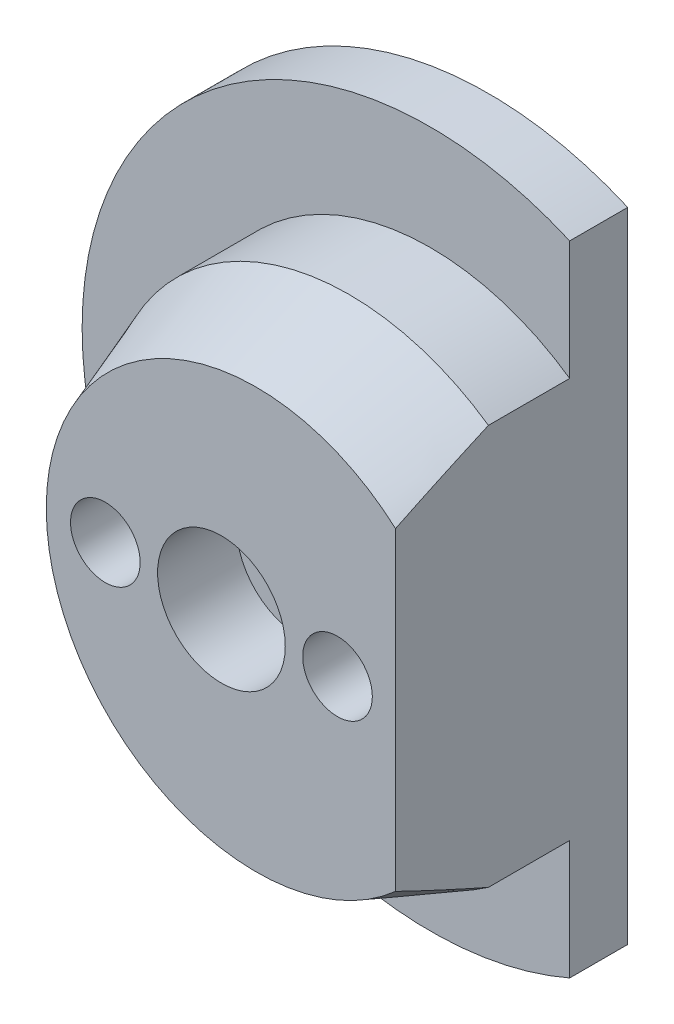
ISO-10303-21;
HEADER;
FILE_DESCRIPTION(('STEP AP214'),'2;1');
FILE_NAME('part.step','',(''),(''),'','','');
FILE_SCHEMA(('AUTOMOTIVE_DESIGN { 1 0 10303 214 1 1 1 1 }'));
ENDSEC;
DATA;
#1=APPLICATION_CONTEXT('core data for automotive mechanical design processes');
#2=APPLICATION_PROTOCOL_DEFINITION('international standard','automotive_design',2000,#1);
#3=PRODUCT_CONTEXT('',#1,'mechanical');
#4=PRODUCT('Part','Part','',(#3));
#5=PRODUCT_RELATED_PRODUCT_CATEGORY('part','',(#4));
#6=PRODUCT_DEFINITION_FORMATION('','',#4);
#7=PRODUCT_DEFINITION_CONTEXT('part definition',#1,'design');
#8=PRODUCT_DEFINITION('design','',#6,#7);
#9=PRODUCT_DEFINITION_SHAPE('','',#8);
#10=(LENGTH_UNIT() NAMED_UNIT(*) SI_UNIT(.MILLI.,.METRE.));
#11=(NAMED_UNIT(*) PLANE_ANGLE_UNIT() SI_UNIT($,.RADIAN.));
#12=(NAMED_UNIT(*) SI_UNIT($,.STERADIAN.) SOLID_ANGLE_UNIT());
#13=UNCERTAINTY_MEASURE_WITH_UNIT(LENGTH_MEASURE(1.E-05),#10,'distance_accuracy_value','');
#14=(GEOMETRIC_REPRESENTATION_CONTEXT(3) GLOBAL_UNCERTAINTY_ASSIGNED_CONTEXT((#13)) GLOBAL_UNIT_ASSIGNED_CONTEXT((#10,
#11,#12)) REPRESENTATION_CONTEXT('',''));
#15=CARTESIAN_POINT('',(0.,0.,0.));
#16=DIRECTION('',(0.,0.,1.));
#17=DIRECTION('',(1.,0.,0.));
#18=AXIS2_PLACEMENT_3D('',#15,#16,#17);
#19=CARTESIAN_POINT('',(0.,0.,20.));
#20=DIRECTION('',(0.,0.,-1.));
#21=DIRECTION('',(-1.,0.,0.));
#22=AXIS2_PLACEMENT_3D('',#19,#20,#21);
#23=CYLINDRICAL_SURFACE('',#22,30.);
#24=CARTESIAN_POINT('',(0.,0.,5.));
#25=DIRECTION('',(0.,0.,1.));
#26=DIRECTION('',(1.,0.,0.));
#27=AXIS2_PLACEMENT_3D('',#24,#25,#26);
#28=CIRCLE('',#27,30.);
#29=CARTESIAN_POINT('',(12.,27.495454169735,5.));
#30=VERTEX_POINT('',#29);
#31=CARTESIAN_POINT('',(12.,-27.495454169735,5.));
#32=VERTEX_POINT('',#31);
#33=EDGE_CURVE('E104',#30,#32,#28,.T.);
#34=ORIENTED_EDGE('',*,*,#33,.F.);
#35=DIRECTION('',(0.,0.,-1.));
#36=VECTOR('',#35,1.);
#37=CARTESIAN_POINT('',(12.,27.495454169735,20.));
#38=LINE('',#37,#36);
#39=CARTESIAN_POINT('',(12.,27.495454169735,0.));
#40=VERTEX_POINT('',#39);
#41=EDGE_CURVE('E61',#30,#40,#38,.T.);
#42=ORIENTED_EDGE('',*,*,#41,.T.);
#43=CARTESIAN_POINT('',(0.,0.,0.));
#44=DIRECTION('',(0.,0.,1.));
#45=DIRECTION('',(1.,0.,0.));
#46=AXIS2_PLACEMENT_3D('',#43,#44,#45);
#47=CIRCLE('',#46,30.);
#48=CARTESIAN_POINT('',(12.,-27.495454169735,0.));
#49=VERTEX_POINT('',#48);
#50=EDGE_CURVE('E98',#40,#49,#47,.T.);
#51=ORIENTED_EDGE('',*,*,#50,.T.);
#52=DIRECTION('',(0.,0.,-1.));
#53=VECTOR('',#52,1.);
#54=CARTESIAN_POINT('',(12.,-27.495454169735,20.));
#55=LINE('',#54,#53);
#56=EDGE_CURVE('E136',#49,#32,#55,.F.);
#57=ORIENTED_EDGE('',*,*,#56,.T.);
#58=EDGE_LOOP('',(#34,#42,#51,#57));
#59=FACE_BOUND('',#58,.T.);
#60=ADVANCED_FACE('F35',(#59),#23,.T.);
#61=CARTESIAN_POINT('',(0.,0.,20.));
#62=DIRECTION('',(0.,0.,1.));
#63=DIRECTION('',(1.,0.,0.));
#64=AXIS2_PLACEMENT_3D('',#61,#62,#63);
#65=PLANE('',#64);
#66=DIRECTION('',(0.,-1.,0.));
#67=VECTOR('',#66,1.);
#68=CARTESIAN_POINT('',(12.,33.1105844431679,20.));
#69=LINE('',#68,#67);
#70=CARTESIAN_POINT('',(12.,13.5345616293322,20.));
#71=VERTEX_POINT('',#70);
#72=CARTESIAN_POINT('',(12.,-13.5345616293321,20.));
#73=VERTEX_POINT('',#72);
#74=EDGE_CURVE('E54',#71,#73,#69,.T.);
#75=ORIENTED_EDGE('',*,*,#74,.F.);
#76=CARTESIAN_POINT('',(0.,0.,20.));
#77=DIRECTION('',(0.,0.,1.));
#78=DIRECTION('',(1.,0.,0.));
#79=AXIS2_PLACEMENT_3D('',#76,#77,#78);
#80=CIRCLE('',#79,18.0882381258704);
#81=EDGE_CURVE('E94',#71,#73,#80,.T.);
#82=ORIENTED_EDGE('',*,*,#81,.T.);
#83=EDGE_LOOP('',(#75,#82));
#84=FACE_BOUND('',#83,.T.);
#85=CARTESIAN_POINT('',(7.,0.,20.));
#86=DIRECTION('',(0.,0.,1.));
#87=DIRECTION('',(1.,0.,0.));
#88=AXIS2_PLACEMENT_3D('',#85,#86,#87);
#89=CIRCLE('',#88,2.99999999999999);
#90=CARTESIAN_POINT('',(9.99999999999999,0.,20.));
#91=VERTEX_POINT('',#90);
#92=EDGE_CURVE('E111',#91,#91,#89,.T.);
#93=ORIENTED_EDGE('',*,*,#92,.F.);
#94=EDGE_LOOP('',(#93));
#95=FACE_BOUND('',#94,.T.);
#96=CARTESIAN_POINT('',(-13.,0.,20.));
#97=DIRECTION('',(0.,0.,1.));
#98=DIRECTION('',(1.,0.,0.));
#99=AXIS2_PLACEMENT_3D('',#96,#97,#98);
#100=CIRCLE('',#99,2.99999999999999);
#101=CARTESIAN_POINT('',(-10.,0.,20.));
#102=VERTEX_POINT('',#101);
#103=EDGE_CURVE('E117',#102,#102,#100,.T.);
#104=ORIENTED_EDGE('',*,*,#103,.F.);
#105=EDGE_LOOP('',(#104));
#106=FACE_BOUND('',#105,.T.);
#107=CARTESIAN_POINT('',(-3.,0.,20.));
#108=DIRECTION('',(0.,0.,1.));
#109=DIRECTION('',(1.,0.,0.));
#110=AXIS2_PLACEMENT_3D('',#107,#108,#109);
#111=CIRCLE('',#110,5.5);
#112=CARTESIAN_POINT('',(2.5,0.,20.));
#113=VERTEX_POINT('',#112);
#114=EDGE_CURVE('E106',#113,#113,#111,.T.);
#115=ORIENTED_EDGE('',*,*,#114,.F.);
#116=EDGE_LOOP('',(#115));
#117=FACE_BOUND('',#116,.T.);
#118=ADVANCED_FACE('F92',(#84,#95,#106,#117),#65,.T.);
#119=CARTESIAN_POINT('',(0.,0.,0.));
#120=DIRECTION('',(0.,0.,1.));
#121=DIRECTION('',(1.,0.,0.));
#122=AXIS2_PLACEMENT_3D('',#119,#120,#121);
#123=PLANE('',#122);
#124=CARTESIAN_POINT('',(-3.,0.,0.));
#125=DIRECTION('',(0.,0.,1.));
#126=DIRECTION('',(1.,0.,0.));
#127=AXIS2_PLACEMENT_3D('',#124,#125,#126);
#128=CIRCLE('',#127,3.3);
#129=CARTESIAN_POINT('',(0.299999999999996,0.,0.));
#130=VERTEX_POINT('',#129);
#131=EDGE_CURVE('E120',#130,#130,#128,.T.);
#132=ORIENTED_EDGE('',*,*,#131,.T.);
#133=EDGE_LOOP('',(#132));
#134=FACE_BOUND('',#133,.T.);
#135=CARTESIAN_POINT('',(-13.,0.,0.));
#136=DIRECTION('',(0.,0.,1.));
#137=DIRECTION('',(1.,0.,0.));
#138=AXIS2_PLACEMENT_3D('',#135,#136,#137);
#139=CIRCLE('',#138,2.99999999999999);
#140=CARTESIAN_POINT('',(-10.,0.,0.));
#141=VERTEX_POINT('',#140);
#142=EDGE_CURVE('E114',#141,#141,#139,.T.);
#143=ORIENTED_EDGE('',*,*,#142,.T.);
#144=EDGE_LOOP('',(#143));
#145=FACE_BOUND('',#144,.T.);
#146=CARTESIAN_POINT('',(7.,0.,0.));
#147=DIRECTION('',(0.,0.,1.));
#148=DIRECTION('',(1.,0.,0.));
#149=AXIS2_PLACEMENT_3D('',#146,#147,#148);
#150=CIRCLE('',#149,2.99999999999999);
#151=CARTESIAN_POINT('',(9.99999999999999,0.,0.));
#152=VERTEX_POINT('',#151);
#153=EDGE_CURVE('E101',#152,#152,#150,.T.);
#154=ORIENTED_EDGE('',*,*,#153,.T.);
#155=EDGE_LOOP('',(#154));
#156=FACE_BOUND('',#155,.T.);
#157=ORIENTED_EDGE('',*,*,#50,.F.);
#158=DIRECTION('',(0.,-1.,0.));
#159=VECTOR('',#158,1.);
#160=CARTESIAN_POINT('',(12.,33.1105844431679,0.));
#161=LINE('',#160,#159);
#162=EDGE_CURVE('E95',#40,#49,#161,.T.);
#163=ORIENTED_EDGE('',*,*,#162,.T.);
#164=EDGE_LOOP('',(#157,#163));
#165=FACE_BOUND('',#164,.T.);
#166=ADVANCED_FACE('F146',(#134,#145,#156,#165),#123,.F.);
#167=CARTESIAN_POINT('',(7.,0.,20.));
#168=DIRECTION('',(0.,0.,1.));
#169=DIRECTION('',(1.,0.,0.));
#170=AXIS2_PLACEMENT_3D('',#167,#168,#169);
#171=CYLINDRICAL_SURFACE('',#170,2.99999999999999);
#172=ORIENTED_EDGE('',*,*,#153,.F.);
#173=EDGE_LOOP('',(#172));
#174=FACE_BOUND('',#173,.T.);
#175=ORIENTED_EDGE('',*,*,#92,.T.);
#176=EDGE_LOOP('',(#175));
#177=FACE_BOUND('',#176,.T.);
#178=ADVANCED_FACE('F171',(#174,#177),#171,.F.);
#179=CARTESIAN_POINT('',(-13.,0.,20.));
#180=DIRECTION('',(0.,0.,1.));
#181=DIRECTION('',(1.,0.,0.));
#182=AXIS2_PLACEMENT_3D('',#179,#180,#181);
#183=CYLINDRICAL_SURFACE('',#182,2.99999999999999);
#184=ORIENTED_EDGE('',*,*,#142,.F.);
#185=EDGE_LOOP('',(#184));
#186=FACE_BOUND('',#185,.T.);
#187=ORIENTED_EDGE('',*,*,#103,.T.);
#188=EDGE_LOOP('',(#187));
#189=FACE_BOUND('',#188,.T.);
#190=ADVANCED_FACE('F176',(#186,#189),#183,.F.);
#191=CARTESIAN_POINT('',(-3.,0.,20.));
#192=DIRECTION('',(0.,0.,1.));
#193=DIRECTION('',(1.,0.,0.));
#194=AXIS2_PLACEMENT_3D('',#191,#192,#193);
#195=CYLINDRICAL_SURFACE('',#194,3.3);
#196=ORIENTED_EDGE('',*,*,#131,.F.);
#197=EDGE_LOOP('',(#196));
#198=FACE_BOUND('',#197,.T.);
#199=CARTESIAN_POINT('',(-3.,0.,13.2));
#200=DIRECTION('',(0.,0.,1.));
#201=DIRECTION('',(1.,0.,0.));
#202=AXIS2_PLACEMENT_3D('',#199,#200,#201);
#203=CIRCLE('',#202,3.3);
#204=CARTESIAN_POINT('',(0.299999999999998,0.,13.2));
#205=VERTEX_POINT('',#204);
#206=EDGE_CURVE('E123',#205,#205,#203,.T.);
#207=ORIENTED_EDGE('',*,*,#206,.T.);
#208=EDGE_LOOP('',(#207));
#209=FACE_BOUND('',#208,.T.);
#210=ADVANCED_FACE('F180',(#198,#209),#195,.F.);
#211=CARTESIAN_POINT('',(0.299999999999998,0.,13.2));
#212=DIRECTION('',(0.,0.,-1.));
#213=DIRECTION('',(-1.,0.,0.));
#214=AXIS2_PLACEMENT_3D('',#211,#212,#213);
#215=PLANE('',#214);
#216=ORIENTED_EDGE('',*,*,#206,.F.);
#217=EDGE_LOOP('',(#216));
#218=FACE_BOUND('',#217,.T.);
#219=CARTESIAN_POINT('',(-3.,0.,13.2));
#220=DIRECTION('',(0.,0.,1.));
#221=DIRECTION('',(1.,0.,0.));
#222=AXIS2_PLACEMENT_3D('',#219,#220,#221);
#223=CIRCLE('',#222,5.5);
#224=CARTESIAN_POINT('',(2.5,0.,13.2));
#225=VERTEX_POINT('',#224);
#226=EDGE_CURVE('E126',#225,#225,#223,.T.);
#227=ORIENTED_EDGE('',*,*,#226,.T.);
#228=EDGE_LOOP('',(#227));
#229=FACE_BOUND('',#228,.T.);
#230=ADVANCED_FACE('F184',(#218,#229),#215,.F.);
#231=CARTESIAN_POINT('',(-3.,0.,20.));
#232=DIRECTION('',(0.,0.,1.));
#233=DIRECTION('',(1.,0.,0.));
#234=AXIS2_PLACEMENT_3D('',#231,#232,#233);
#235=CYLINDRICAL_SURFACE('',#234,5.5);
#236=ORIENTED_EDGE('',*,*,#226,.F.);
#237=EDGE_LOOP('',(#236));
#238=FACE_BOUND('',#237,.T.);
#239=ORIENTED_EDGE('',*,*,#114,.T.);
#240=EDGE_LOOP('',(#239));
#241=FACE_BOUND('',#240,.T.);
#242=ADVANCED_FACE('F162',(#238,#241),#235,.F.);
#243=CARTESIAN_POINT('',(0.,0.,5.));
#244=DIRECTION('',(0.,0.,1.));
#245=DIRECTION('',(1.,0.,0.));
#246=AXIS2_PLACEMENT_3D('',#243,#244,#245);
#247=PLANE('',#246);
#248=DIRECTION('',(0.,-1.,0.));
#249=VECTOR('',#248,1.);
#250=CARTESIAN_POINT('',(12.,0.,5.));
#251=LINE('',#250,#249);
#252=CARTESIAN_POINT('',(12.,17.2336879396141,5.));
#253=VERTEX_POINT('',#252);
#254=EDGE_CURVE('E134',#30,#253,#251,.T.);
#255=ORIENTED_EDGE('',*,*,#254,.F.);
#256=ORIENTED_EDGE('',*,*,#33,.T.);
#257=CARTESIAN_POINT('',(12.,-17.2336879396141,5.));
#258=VERTEX_POINT('',#257);
#259=EDGE_CURVE('E139',#258,#32,#251,.T.);
#260=ORIENTED_EDGE('',*,*,#259,.F.);
#261=CARTESIAN_POINT('',(0.,0.,5.));
#262=DIRECTION('',(0.,0.,1.));
#263=DIRECTION('',(1.,0.,0.));
#264=AXIS2_PLACEMENT_3D('',#261,#262,#263);
#265=CIRCLE('',#264,21.);
#266=EDGE_CURVE('E107',#253,#258,#265,.T.);
#267=ORIENTED_EDGE('',*,*,#266,.F.);
#268=EDGE_LOOP('',(#255,#256,#260,#267));
#269=FACE_BOUND('',#268,.T.);
#270=ADVANCED_FACE('F151',(#269),#247,.T.);
#271=CARTESIAN_POINT('',(0.,0.,5.));
#272=DIRECTION('',(0.,0.,1.));
#273=DIRECTION('',(1.,0.,0.));
#274=AXIS2_PLACEMENT_3D('',#271,#272,#273);
#275=CYLINDRICAL_SURFACE('',#274,21.);
#276=DIRECTION('',(0.,0.,1.));
#277=VECTOR('',#276,1.);
#278=CARTESIAN_POINT('',(12.,-17.2336879396141,5.));
#279=LINE('',#278,#277);
#280=CARTESIAN_POINT('',(12.,-17.2336879396141,11.9999999999999));
#281=VERTEX_POINT('',#280);
#282=EDGE_CURVE('E141',#281,#258,#279,.F.);
#283=ORIENTED_EDGE('',*,*,#282,.F.);
#284=CARTESIAN_POINT('',(0.,0.,11.9999999999999));
#285=DIRECTION('',(0.,0.,1.));
#286=DIRECTION('',(1.,0.,0.));
#287=AXIS2_PLACEMENT_3D('',#284,#285,#286);
#288=CIRCLE('',#287,21.);
#289=CARTESIAN_POINT('',(12.,17.2336879396141,11.9999999999999));
#290=VERTEX_POINT('',#289);
#291=EDGE_CURVE('E97',#281,#290,#288,.F.);
#292=ORIENTED_EDGE('',*,*,#291,.T.);
#293=DIRECTION('',(0.,0.,1.));
#294=VECTOR('',#293,1.);
#295=CARTESIAN_POINT('',(12.,17.2336879396141,5.));
#296=LINE('',#295,#294);
#297=EDGE_CURVE('E85',#253,#290,#296,.T.);
#298=ORIENTED_EDGE('',*,*,#297,.F.);
#299=ORIENTED_EDGE('',*,*,#266,.T.);
#300=EDGE_LOOP('',(#283,#292,#298,#299));
#301=FACE_BOUND('',#300,.T.);
#302=ADVANCED_FACE('F155',(#301),#275,.T.);
#303=CARTESIAN_POINT('',(0.,0.,20.));
#304=DIRECTION('',(0.,0.,-1.));
#305=DIRECTION('',(-1.,0.,0.));
#306=AXIS2_PLACEMENT_3D('',#303,#304,#305);
#307=CONICAL_SURFACE('',#306,18.0882381258704,0.349065850398864);
#308=CARTESIAN_POINT('',(12.,27.8627921842662,-13.6532699917184));
#309=CARTESIAN_POINT('',(12.,27.5269303451549,-12.8057678823775));
#310=CARTESIAN_POINT('',(12.,27.190255304696,-11.9585879482232));
#311=CARTESIAN_POINT('',(12.,26.5150731815659,-10.2649565523234));
#312=CARTESIAN_POINT('',(12.,26.17656609521,-9.41850509204704));
#313=CARTESIAN_POINT('',(12.,25.1578988268715,-6.88014668728818));
#314=CARTESIAN_POINT('',(12.,24.4746830494429,-5.18946419126289));
#315=CARTESIAN_POINT('',(12.,23.0944329635771,-1.80368979563468));
#316=CARTESIAN_POINT('',(12.,22.397345983629,-0.108619321788312));
#317=CARTESIAN_POINT('',(12.,21.3415522083334,2.4296535624447));
#318=CARTESIAN_POINT('',(12.,20.9879459882088,3.27497790524608));
#319=CARTESIAN_POINT('',(12.,20.2767930085017,4.96396673231057));
#320=CARTESIAN_POINT('',(12.,19.9192462564351,5.8076312197359));
#321=CARTESIAN_POINT('',(12.,19.1769538220619,7.54598080902825));
#322=CARTESIAN_POINT('',(12.,18.7919112674247,8.44053927464228));
#323=CARTESIAN_POINT('',(12.,18.0156836627609,10.2269958589293));
#324=CARTESIAN_POINT('',(12.,17.6244985760251,11.1188939616655));
#325=CARTESIAN_POINT('',(12.,16.8346130582242,12.899738888183));
#326=CARTESIAN_POINT('',(12.,16.4359100319216,13.788684563442));
#327=CARTESIAN_POINT('',(12.,15.8310978079059,15.1190170133838));
#328=CARTESIAN_POINT('',(12.,15.6283698355904,15.5619417160455));
#329=CARTESIAN_POINT('',(12.,15.2203936692814,16.4466391699383));
#330=CARTESIAN_POINT('',(12.,15.0151454270901,16.8884118989424));
#331=CARTESIAN_POINT('',(12.,14.396221576551,18.2095882149797));
#332=CARTESIAN_POINT('',(12.,13.9783729154638,19.0870435490182));
#333=CARTESIAN_POINT('',(12.,13.1286035559411,20.8351136782033));
#334=CARTESIAN_POINT('',(12.,12.6966833158436,21.7057286950077));
#335=CARTESIAN_POINT('',(12.,12.0351318782816,23.0043944974888));
#336=CARTESIAN_POINT('',(12.,11.8123972967429,23.4359597871162));
#337=CARTESIAN_POINT('',(12.,11.3615989332278,24.2962948610046));
#338=CARTESIAN_POINT('',(12.,11.133535238084,24.7250646906694));
#339=CARTESIAN_POINT('',(12.,10.6712320171181,25.5791824866141));
#340=CARTESIAN_POINT('',(12.,10.4369934333098,26.0045309620664));
#341=CARTESIAN_POINT('',(12.,9.96120565311268,26.8511114617738));
#342=CARTESIAN_POINT('',(12.,9.71965676400346,27.2723436580696));
#343=CARTESIAN_POINT('',(12.,9.34096939223687,27.9170369772876));
#344=CARTESIAN_POINT('',(12.,9.20692723812772,28.1423185249741));
#345=CARTESIAN_POINT('',(12.,8.93601058338162,28.5911823919282));
#346=CARTESIAN_POINT('',(12.,8.79913600512107,28.8147646643963));
#347=CARTESIAN_POINT('',(12.,8.52220894662858,29.2600357070208));
#348=CARTESIAN_POINT('',(12.,8.38215567266477,29.4817239847886));
#349=CARTESIAN_POINT('',(12.,8.09853365048677,29.9228303847873));
#350=CARTESIAN_POINT('',(12.,7.95496493276733,30.1422485266871));
#351=CARTESIAN_POINT('',(12.,7.51929417611104,30.7951955772066));
#352=CARTESIAN_POINT('',(12.,7.22132811860112,31.2248759456881));
#353=CARTESIAN_POINT('',(12.,6.75940524312776,31.858376249906));
#354=CARTESIAN_POINT('',(12.,6.60295485292952,32.06768202676));
#355=CARTESIAN_POINT('',(12.,6.28430545347912,32.4818633159478));
#356=CARTESIAN_POINT('',(12.,6.12210689770334,32.6867391757164));
#357=CARTESIAN_POINT('',(12.,5.79135812549224,33.0907763122132));
#358=CARTESIAN_POINT('',(12.,5.62281834957678,33.2899461065183));
#359=CARTESIAN_POINT('',(12.,5.27809859122262,33.6816226995259));
#360=CARTESIAN_POINT('',(12.,5.10191798715803,33.8741289538109));
#361=CARTESIAN_POINT('',(12.,4.74061478392718,34.2507899434683));
#362=CARTESIAN_POINT('',(12.,4.55548781965358,34.4349405152167));
#363=CARTESIAN_POINT('',(12.,4.17498157424941,34.7923301720711));
#364=CARTESIAN_POINT('',(12.,3.97960489540224,34.965572002438));
#365=CARTESIAN_POINT('',(12.,3.63072968345129,35.2534289090949));
#366=CARTESIAN_POINT('',(12.,3.47997608501266,35.3713480730275));
#367=CARTESIAN_POINT('',(12.,3.17151656273944,35.5976979533838));
#368=CARTESIAN_POINT('',(12.,3.01380919906929,35.7061266907295));
#369=CARTESIAN_POINT('',(12.,2.52999292306273,36.0135197764038));
#370=CARTESIAN_POINT('',(12.,2.19229489507984,36.1953609892394));
#371=CARTESIAN_POINT('',(12.,1.59488746014511,36.443976425643));
#372=CARTESIAN_POINT('',(12.,1.34290283585694,36.5289333305314));
#373=CARTESIAN_POINT('',(12.,0.957226750336066,36.624448426648));
#374=CARTESIAN_POINT('',(12.,0.827423730336714,36.6509636735217));
#375=CARTESIAN_POINT('',(12.,0.566023786232368,36.6925824294777));
#376=CARTESIAN_POINT('',(12.,0.434427620295467,36.7076906179948));
#377=CARTESIAN_POINT('',(12.,0.169704711946813,36.7260153761481));
#378=CARTESIAN_POINT('',(12.,0.036573554444198,36.7291685337364));
#379=CARTESIAN_POINT('',(12.,-0.229415404281603,36.7232964438738));
#380=CARTESIAN_POINT('',(12.,-0.362273210059866,36.7142714010312));
#381=CARTESIAN_POINT('',(12.,-0.626750193585971,36.6843564723428));
#382=CARTESIAN_POINT('',(12.,-0.758368216403325,36.6634564585075));
#383=CARTESIAN_POINT('',(12.,-1.01938258499839,36.6104861797242));
#384=CARTESIAN_POINT('',(12.,-1.14877772506934,36.5784100417518));
#385=CARTESIAN_POINT('',(12.,-1.43792928091777,36.4943616817248));
#386=CARTESIAN_POINT('',(12.,-1.59681226907911,36.4393830739181));
#387=CARTESIAN_POINT('',(12.,-1.90906952419009,36.3153863488714));
#388=CARTESIAN_POINT('',(12.,-2.06243927901492,36.2463570268275));
#389=CARTESIAN_POINT('',(12.,-2.36346767718164,36.0963734909704));
#390=CARTESIAN_POINT('',(12.,-2.51111757973566,36.0154018700307));
#391=CARTESIAN_POINT('',(12.,-2.80047424963575,35.8436088563508));
#392=CARTESIAN_POINT('',(12.,-2.94218218549772,35.7527894129485));
#393=CARTESIAN_POINT('',(12.,-3.34296373773319,35.4789695266051));
#394=CARTESIAN_POINT('',(12.,-3.59491024751371,35.2855243157096));
#395=CARTESIAN_POINT('',(12.,-4.08164901685311,34.8781169400889));
#396=CARTESIAN_POINT('',(12.,-4.31642377449195,34.6641343427457));
#397=CARTESIAN_POINT('',(12.,-4.77229091292958,34.2205924661141));
#398=CARTESIAN_POINT('',(12.,-4.993331845601,33.9909806624015));
#399=CARTESIAN_POINT('',(12.,-5.31567694642108,33.6383591670288));
#400=CARTESIAN_POINT('',(12.,-5.42156654319537,33.5194789568974));
#401=CARTESIAN_POINT('',(12.,-5.63056259768669,33.2792958348862));
#402=CARTESIAN_POINT('',(12.,-5.73366908506783,33.1579929488527));
#403=CARTESIAN_POINT('',(12.,-6.04347369529155,32.7857595192755));
#404=CARTESIAN_POINT('',(12.,-6.24615137244229,32.5314783355501));
#405=CARTESIAN_POINT('',(12.,-6.64264269564426,32.016073367423));
#406=CARTESIAN_POINT('',(12.,-6.83645476569536,31.7549483793055));
#407=CARTESIAN_POINT('',(12.,-7.21665448467623,31.2271238847466));
#408=CARTESIAN_POINT('',(12.,-7.40303758747438,30.9604211126877));
#409=CARTESIAN_POINT('',(12.,-7.7693564602447,30.4226127617991));
#410=CARTESIAN_POINT('',(12.,-7.94929181398416,30.1515069003651));
#411=CARTESIAN_POINT('',(12.,-8.30398774631847,29.6050694347222));
#412=CARTESIAN_POINT('',(12.,-8.47873575058897,29.3297296849453));
#413=CARTESIAN_POINT('',(12.,-8.82335815693111,28.7760129455374));
#414=CARTESIAN_POINT('',(12.,-8.99323240195335,28.4976358584309));
#415=CARTESIAN_POINT('',(12.,-9.49650023059981,27.6586325087388));
#416=CARTESIAN_POINT('',(12.,-9.8235143515077,27.094172408394));
#417=CARTESIAN_POINT('',(12.,-10.3052052990708,26.2397658428952));
#418=CARTESIAN_POINT('',(12.,-10.4648711284808,25.9526011397048));
#419=CARTESIAN_POINT('',(12.,-10.7811488369033,25.3766186661629));
#420=CARTESIAN_POINT('',(12.,-10.9377609315133,25.0878010143876));
#421=CARTESIAN_POINT('',(12.,-11.4035500321368,24.2191059097175));
#422=CARTESIAN_POINT('',(12.,-11.708649120016,23.6370411311594));
#423=CARTESIAN_POINT('',(12.,-12.3094919401049,22.4692842236551));
#424=CARTESIAN_POINT('',(12.,-12.6052497095168,21.8835992903212));
#425=CARTESIAN_POINT('',(12.,-13.189400345918,20.7085927875223));
#426=CARTESIAN_POINT('',(12.,-13.4777934035995,20.1192713127089));
#427=CARTESIAN_POINT('',(12.,-14.0959953103404,18.8390591148636));
#428=CARTESIAN_POINT('',(12.,-14.4246852013033,18.1476287319529));
#429=CARTESIAN_POINT('',(12.,-15.0750749366526,16.7614840199671));
#430=CARTESIAN_POINT('',(12.,-15.3967746954408,16.0667696508042));
#431=CARTESIAN_POINT('',(12.,-16.0343051558443,14.6746136719075));
#432=CARTESIAN_POINT('',(12.,-16.35013556017,13.9771719261828));
#433=CARTESIAN_POINT('',(12.,-16.976782115366,12.5800377920662));
#434=CARTESIAN_POINT('',(12.,-17.2875982390254,11.8803453914853));
#435=CARTESIAN_POINT('',(12.,-18.21416387809,9.77718784170915));
#436=CARTESIAN_POINT('',(12.,-18.8234663954159,8.37088177863657));
#437=CARTESIAN_POINT('',(12.,-20.0290704522524,5.55277296489162));
#438=CARTESIAN_POINT('',(12.,-20.6253723475284,4.14097036588255));
#439=CARTESIAN_POINT('',(12.,-21.7852918615802,1.367057282808));
#440=CARTESIAN_POINT('',(12.,-22.3492886580487,0.00510516271500579));
#441=CARTESIAN_POINT('',(12.,-23.4697528223054,-2.7219045529111));
#442=CARTESIAN_POINT('',(12.,-24.0262201172094,-4.08696217835578));
#443=CARTESIAN_POINT('',(12.,-25.1322767641274,-6.81774934285578));
#444=CARTESIAN_POINT('',(12.,-25.6818742660566,-8.18347558429767));
#445=CARTESIAN_POINT('',(12.,-26.7759326254463,-10.9169536493312));
#446=CARTESIAN_POINT('',(12.,-27.3203935833161,-12.2847054327202));
#447=CARTESIAN_POINT('',(12.,-27.8627921842662,-13.6532699917184));
#448=B_SPLINE_CURVE_WITH_KNOTS('',3,(#308,#309,#310,#311,#312,#313,#314,#315,#316,#317,#318,
#319,#320,#321,#322,#323,#324,#325,#326,#327,#328,#329,#330,#331,#332,#333,#334,#335,#336,#337,
#338,#339,#340,#341,#342,#343,#344,#345,#346,#347,#348,#349,#350,#351,#352,#353,#354,#355,#356,
#357,#358,#359,#360,#361,#362,#363,#364,#365,#366,#367,#368,#369,#370,#371,#372,#373,#374,#375,
#376,#377,#378,#379,#380,#381,#382,#383,#384,#385,#386,#387,#388,#389,#390,#391,#392,#393,#394,
#395,#396,#397,#398,#399,#400,#401,#402,#403,#404,#405,#406,#407,#408,#409,#410,#411,#412,#413,
#414,#415,#416,#417,#418,#419,#420,#421,#422,#423,#424,#425,#426,#427,#428,#429,#430,#431,#432,
#433,#434,#435,#436,#437,#438,#439,#440,#441,#442,#443,#444,#445,#446,#447),.UNSPECIFIED.,.F.,
.F.,(4,2,2,2,2,2,2,2,2,2,2,2,2,2,2,2,2,2,2,2,2,2,2,2,2,2,2,2,2,2,2,2,2,2,2,2,2,2,2,2,2,2,2,2,2,
2,2,2,2,2,2,2,2,2,2,2,2,2,2,2,2,2,2,2,2,2,2,2,2,4),(0.,2.73487919488528,5.46976389270213,
10.9402704166083,16.4386505362427,19.1875505746995,21.9364453710917,24.858143356318,
27.7798588089841,30.7026020217816,32.1639398350145,33.6253056386659,36.5408128673464,
39.4562252271761,40.9131563543843,42.3700637588503,43.8267501756905,45.2833754473542,
46.0697878225098,46.8562217781981,47.6428543181279,48.4294800368189,49.9975922071917,
50.7814615141831,51.5652691182958,52.347838308273,53.1304712846859,53.9134900566956,
54.6963109824739,55.2701413916217,55.8440911803222,56.9884737667778,57.782954630508,
58.1799642178696,58.5768108542455,58.9757595290968,59.3747015012158,59.7739842369673,
60.1734771120162,60.6770567819785,61.1810396182535,61.6857644573225,62.1903895698394,
63.1416326185508,64.0938320665203,65.0494066694823,65.52697975976,66.0045477577528,
66.9798000433028,67.9552250267525,68.9312380301976,69.9073139268069,70.8855892815663,
71.8638961244211,73.8206461120213,74.8063389480188,75.79196193902,77.7633964405055,
79.7317119896772,81.6999765220692,83.9966686420316,86.2933888705314,88.5902251152906,
90.8870738200853,95.4848564216926,100.082513045496,104.504820671409,108.927171073914,
113.343650737523,117.760043888135),.UNSPECIFIED.);
#449=EDGE_CURVE('E12',#290,#71,#448,.T.);
#450=ORIENTED_EDGE('',*,*,#449,.F.);
#451=ORIENTED_EDGE('',*,*,#291,.F.);
#452=EDGE_CURVE('E40',#73,#281,#448,.T.);
#453=ORIENTED_EDGE('',*,*,#452,.F.);
#454=ORIENTED_EDGE('',*,*,#81,.F.);
#455=EDGE_LOOP('',(#450,#451,#453,#454));
#456=FACE_BOUND('',#455,.T.);
#457=ADVANCED_FACE('F37',(#456),#307,.T.);
#458=CARTESIAN_POINT('',(12.,33.1105844431679,0.));
#459=DIRECTION('',(-1.,0.,0.));
#460=DIRECTION('',(0.,-1.,0.));
#461=AXIS2_PLACEMENT_3D('',#458,#459,#460);
#462=PLANE('',#461);
#463=ORIENTED_EDGE('',*,*,#254,.T.);
#464=ORIENTED_EDGE('',*,*,#297,.T.);
#465=ORIENTED_EDGE('',*,*,#449,.T.);
#466=ORIENTED_EDGE('',*,*,#74,.T.);
#467=ORIENTED_EDGE('',*,*,#452,.T.);
#468=ORIENTED_EDGE('',*,*,#282,.T.);
#469=ORIENTED_EDGE('',*,*,#259,.T.);
#470=ORIENTED_EDGE('',*,*,#56,.F.);
#471=ORIENTED_EDGE('',*,*,#162,.F.);
#472=ORIENTED_EDGE('',*,*,#41,.F.);
#473=EDGE_LOOP('',(#463,#464,#465,#466,#467,#468,#469,#470,#471,#472));
#474=FACE_BOUND('',#473,.T.);
#475=ADVANCED_FACE('F83',(#474),#462,.F.);
#476=CLOSED_SHELL('',(#60,#118,#166,#178,#190,#210,#230,#242,#270,#302,#457,#475));
#477=MANIFOLD_SOLID_BREP('B2',#476);
#478=ADVANCED_BREP_SHAPE_REPRESENTATION('',(#18,#477),#14);
#479=SHAPE_DEFINITION_REPRESENTATION(#9,#478);
ENDSEC;
END-ISO-10303-21;
